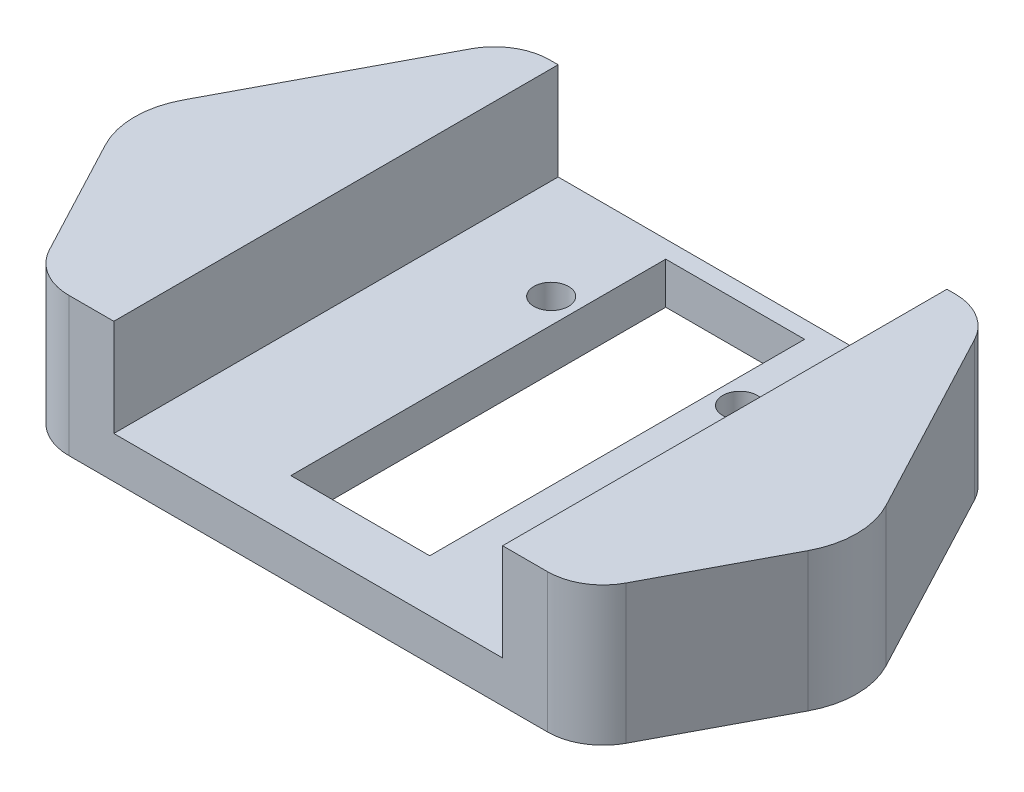
ISO-10303-21;
HEADER;
FILE_DESCRIPTION(('STEP AP214'),'2;1');
FILE_NAME('part.step','',(''),(''),'','','');
FILE_SCHEMA(('AUTOMOTIVE_DESIGN { 1 0 10303 214 1 1 1 1 }'));
ENDSEC;
DATA;
#1=APPLICATION_CONTEXT('core data for automotive mechanical design processes');
#2=APPLICATION_PROTOCOL_DEFINITION('international standard','automotive_design',2000,#1);
#3=PRODUCT_CONTEXT('',#1,'mechanical');
#4=PRODUCT('Part','Part','',(#3));
#5=PRODUCT_RELATED_PRODUCT_CATEGORY('part','',(#4));
#6=PRODUCT_DEFINITION_FORMATION('','',#4);
#7=PRODUCT_DEFINITION_CONTEXT('part definition',#1,'design');
#8=PRODUCT_DEFINITION('design','',#6,#7);
#9=PRODUCT_DEFINITION_SHAPE('','',#8);
#10=(LENGTH_UNIT() NAMED_UNIT(*) SI_UNIT(.MILLI.,.METRE.));
#11=(NAMED_UNIT(*) PLANE_ANGLE_UNIT() SI_UNIT($,.RADIAN.));
#12=(NAMED_UNIT(*) SI_UNIT($,.STERADIAN.) SOLID_ANGLE_UNIT());
#13=UNCERTAINTY_MEASURE_WITH_UNIT(LENGTH_MEASURE(1.E-05),#10,'distance_accuracy_value','');
#14=(GEOMETRIC_REPRESENTATION_CONTEXT(3) GLOBAL_UNCERTAINTY_ASSIGNED_CONTEXT((#13)) GLOBAL_UNIT_ASSIGNED_CONTEXT((#10,
#11,#12)) REPRESENTATION_CONTEXT('',''));
#15=CARTESIAN_POINT('',(0.,0.,0.));
#16=DIRECTION('',(0.,0.,1.));
#17=DIRECTION('',(1.,0.,0.));
#18=AXIS2_PLACEMENT_3D('',#15,#16,#17);
#19=CARTESIAN_POINT('',(-20.,10.,-3.74999999999999));
#20=DIRECTION('',(0.,-1.,0.));
#21=DIRECTION('',(0.,0.,-1.));
#22=AXIS2_PLACEMENT_3D('',#19,#20,#21);
#23=CYLINDRICAL_SURFACE('',#22,2.);
#24=CARTESIAN_POINT('',(-20.,0.,-3.74999999999999));
#25=DIRECTION('',(0.,1.,0.));
#26=DIRECTION('',(0.,0.,1.));
#27=AXIS2_PLACEMENT_3D('',#24,#25,#26);
#28=CIRCLE('',#27,2.);
#29=CARTESIAN_POINT('',(-20.,0.,-1.74999999999999));
#30=VERTEX_POINT('',#29);
#31=EDGE_CURVE('E228',#30,#30,#28,.T.);
#32=ORIENTED_EDGE('',*,*,#31,.F.);
#33=EDGE_LOOP('',(#32));
#34=FACE_BOUND('',#33,.T.);
#35=CARTESIAN_POINT('',(-20.,7.,-3.74999999999999));
#36=DIRECTION('',(0.,1.,0.));
#37=DIRECTION('',(0.,0.,1.));
#38=AXIS2_PLACEMENT_3D('',#35,#36,#37);
#39=CIRCLE('',#38,2.);
#40=CARTESIAN_POINT('',(-20.,7.,-1.74999999999999));
#41=VERTEX_POINT('',#40);
#42=EDGE_CURVE('E222',#41,#41,#39,.T.);
#43=ORIENTED_EDGE('',*,*,#42,.T.);
#44=EDGE_LOOP('',(#43));
#45=FACE_BOUND('',#44,.T.);
#46=ADVANCED_FACE('F40',(#34,#45),#23,.F.);
#47=CARTESIAN_POINT('',(20.,10.,-3.74999999999999));
#48=DIRECTION('',(0.,-1.,0.));
#49=DIRECTION('',(0.,0.,-1.));
#50=AXIS2_PLACEMENT_3D('',#47,#48,#49);
#51=CYLINDRICAL_SURFACE('',#50,2.00000000000001);
#52=CARTESIAN_POINT('',(20.,0.,-3.74999999999999));
#53=DIRECTION('',(0.,1.,0.));
#54=DIRECTION('',(0.,0.,1.));
#55=AXIS2_PLACEMENT_3D('',#52,#53,#54);
#56=CIRCLE('',#55,2.00000000000001);
#57=CARTESIAN_POINT('',(20.,0.,-1.74999999999998));
#58=VERTEX_POINT('',#57);
#59=EDGE_CURVE('E263',#58,#58,#56,.T.);
#60=ORIENTED_EDGE('',*,*,#59,.F.);
#61=EDGE_LOOP('',(#60));
#62=FACE_BOUND('',#61,.T.);
#63=CARTESIAN_POINT('',(20.,7.,-3.74999999999999));
#64=DIRECTION('',(0.,1.,0.));
#65=DIRECTION('',(0.,0.,1.));
#66=AXIS2_PLACEMENT_3D('',#63,#64,#65);
#67=CIRCLE('',#66,2.00000000000001);
#68=CARTESIAN_POINT('',(20.,7.,-1.74999999999998));
#69=VERTEX_POINT('',#68);
#70=EDGE_CURVE('E225',#69,#69,#67,.T.);
#71=ORIENTED_EDGE('',*,*,#70,.T.);
#72=EDGE_LOOP('',(#71));
#73=FACE_BOUND('',#72,.T.);
#74=ADVANCED_FACE('F373',(#62,#73),#51,.F.);
#75=CARTESIAN_POINT('',(0.,3.,0.));
#76=DIRECTION('',(0.,-1.,0.));
#77=DIRECTION('',(0.,0.,-1.));
#78=AXIS2_PLACEMENT_3D('',#75,#76,#77);
#79=PLANE('',#78);
#80=CARTESIAN_POINT('',(-6.8,3.,-14.55));
#81=DIRECTION('',(0.,1.,0.));
#82=DIRECTION('',(0.,0.,1.));
#83=AXIS2_PLACEMENT_3D('',#80,#81,#82);
#84=CIRCLE('',#83,1.25);
#85=CARTESIAN_POINT('',(-6.8,3.,-13.3));
#86=VERTEX_POINT('',#85);
#87=EDGE_CURVE('E202',#86,#86,#84,.T.);
#88=ORIENTED_EDGE('',*,*,#87,.F.);
#89=EDGE_LOOP('',(#88));
#90=FACE_BOUND('',#89,.T.);
#91=CARTESIAN_POINT('',(6.8,3.,-14.55));
#92=DIRECTION('',(0.,1.,0.));
#93=DIRECTION('',(0.,0.,1.));
#94=AXIS2_PLACEMENT_3D('',#91,#92,#93);
#95=CIRCLE('',#94,1.25);
#96=CARTESIAN_POINT('',(6.8,3.,-13.3));
#97=VERTEX_POINT('',#96);
#98=EDGE_CURVE('E199',#97,#97,#95,.T.);
#99=ORIENTED_EDGE('',*,*,#98,.F.);
#100=EDGE_LOOP('',(#99));
#101=FACE_BOUND('',#100,.T.);
#102=DIRECTION('',(1.,0.,0.));
#103=VECTOR('',#102,1.);
#104=CARTESIAN_POINT('',(-5.,3.,6.));
#105=LINE('',#104,#103);
#106=CARTESIAN_POINT('',(-5.,3.,6.));
#107=VERTEX_POINT('',#106);
#108=CARTESIAN_POINT('',(5.,3.,6.));
#109=VERTEX_POINT('',#108);
#110=EDGE_CURVE('E198',#107,#109,#105,.T.);
#111=ORIENTED_EDGE('',*,*,#110,.F.);
#112=DIRECTION('',(0.,0.,1.));
#113=VECTOR('',#112,1.);
#114=CARTESIAN_POINT('',(-5.,3.,-21.));
#115=LINE('',#114,#113);
#116=CARTESIAN_POINT('',(-5.,3.,-21.));
#117=VERTEX_POINT('',#116);
#118=EDGE_CURVE('E57',#117,#107,#115,.T.);
#119=ORIENTED_EDGE('',*,*,#118,.F.);
#120=DIRECTION('',(-1.,0.,0.));
#121=VECTOR('',#120,1.);
#122=CARTESIAN_POINT('',(-5.,3.,-21.));
#123=LINE('',#122,#121);
#124=CARTESIAN_POINT('',(5.,3.,-21.));
#125=VERTEX_POINT('',#124);
#126=EDGE_CURVE('E186',#125,#117,#123,.T.);
#127=ORIENTED_EDGE('',*,*,#126,.F.);
#128=DIRECTION('',(0.,0.,-1.));
#129=VECTOR('',#128,1.);
#130=CARTESIAN_POINT('',(5.,3.,-21.));
#131=LINE('',#130,#129);
#132=EDGE_CURVE('E192',#109,#125,#131,.T.);
#133=ORIENTED_EDGE('',*,*,#132,.F.);
#134=EDGE_LOOP('',(#111,#119,#127,#133));
#135=FACE_BOUND('',#134,.T.);
#136=DIRECTION('',(0.,0.,-1.));
#137=VECTOR('',#136,1.);
#138=CARTESIAN_POINT('',(-14.,3.,0.));
#139=LINE('',#138,#137);
#140=CARTESIAN_POINT('',(-14.,3.,9.75));
#141=VERTEX_POINT('',#140);
#142=CARTESIAN_POINT('',(-14.,3.,-22.25));
#143=VERTEX_POINT('',#142);
#144=EDGE_CURVE('E261',#141,#143,#139,.T.);
#145=ORIENTED_EDGE('',*,*,#144,.F.);
#146=DIRECTION('',(1.,0.,0.));
#147=VECTOR('',#146,1.);
#148=CARTESIAN_POINT('',(0.,3.,9.75));
#149=LINE('',#148,#147);
#150=CARTESIAN_POINT('',(14.,3.,9.75000000000001));
#151=VERTEX_POINT('',#150);
#152=EDGE_CURVE('E216',#141,#151,#149,.T.);
#153=ORIENTED_EDGE('',*,*,#152,.T.);
#154=DIRECTION('',(0.,0.,1.));
#155=VECTOR('',#154,1.);
#156=CARTESIAN_POINT('',(14.,3.,0.));
#157=LINE('',#156,#155);
#158=CARTESIAN_POINT('',(14.,3.,-22.25));
#159=VERTEX_POINT('',#158);
#160=EDGE_CURVE('E293',#159,#151,#157,.T.);
#161=ORIENTED_EDGE('',*,*,#160,.F.);
#162=DIRECTION('',(-1.,0.,0.));
#163=VECTOR('',#162,1.);
#164=CARTESIAN_POINT('',(-14.,3.,-22.25));
#165=LINE('',#164,#163);
#166=EDGE_CURVE('E297',#159,#143,#165,.T.);
#167=ORIENTED_EDGE('',*,*,#166,.T.);
#168=EDGE_LOOP('',(#145,#153,#161,#167));
#169=FACE_BOUND('',#168,.T.);
#170=ADVANCED_FACE('F196',(#90,#101,#135,#169),#79,.F.);
#171=CARTESIAN_POINT('',(-14.,3.,-22.25));
#172=DIRECTION('',(0.,0.,1.));
#173=DIRECTION('',(1.,0.,0.));
#174=AXIS2_PLACEMENT_3D('',#171,#172,#173);
#175=PLANE('',#174);
#176=DIRECTION('',(-1.,0.,0.));
#177=VECTOR('',#176,1.);
#178=CARTESIAN_POINT('',(14.,10.,-22.25));
#179=LINE('',#178,#177);
#180=CARTESIAN_POINT('',(14.5909745461935,10.,-22.25));
#181=VERTEX_POINT('',#180);
#182=CARTESIAN_POINT('',(14.,10.,-22.25));
#183=VERTEX_POINT('',#182);
#184=EDGE_CURVE('E267',#181,#183,#179,.T.);
#185=ORIENTED_EDGE('',*,*,#184,.F.);
#186=DIRECTION('',(0.,-1.,0.));
#187=VECTOR('',#186,1.);
#188=CARTESIAN_POINT('',(14.5909745461935,3.,-22.25));
#189=LINE('',#188,#187);
#190=CARTESIAN_POINT('',(14.5909745461935,0.,-22.25));
#191=VERTEX_POINT('',#190);
#192=EDGE_CURVE('E304',#181,#191,#189,.T.);
#193=ORIENTED_EDGE('',*,*,#192,.T.);
#194=DIRECTION('',(-1.,0.,0.));
#195=VECTOR('',#194,1.);
#196=CARTESIAN_POINT('',(-14.,0.,-22.25));
#197=LINE('',#196,#195);
#198=CARTESIAN_POINT('',(-14.5909745461935,0.,-22.25));
#199=VERTEX_POINT('',#198);
#200=EDGE_CURVE('E296',#191,#199,#197,.T.);
#201=ORIENTED_EDGE('',*,*,#200,.T.);
#202=DIRECTION('',(0.,-1.,0.));
#203=VECTOR('',#202,1.);
#204=CARTESIAN_POINT('',(-14.5909745461935,3.,-22.25));
#205=LINE('',#204,#203);
#206=CARTESIAN_POINT('',(-14.5909745461935,10.,-22.25));
#207=VERTEX_POINT('',#206);
#208=EDGE_CURVE('E300',#199,#207,#205,.F.);
#209=ORIENTED_EDGE('',*,*,#208,.T.);
#210=DIRECTION('',(-1.,0.,0.));
#211=VECTOR('',#210,1.);
#212=CARTESIAN_POINT('',(-14.,10.,-22.25));
#213=LINE('',#212,#211);
#214=CARTESIAN_POINT('',(-14.,10.,-22.25));
#215=VERTEX_POINT('',#214);
#216=EDGE_CURVE('E241',#215,#207,#213,.T.);
#217=ORIENTED_EDGE('',*,*,#216,.F.);
#218=DIRECTION('',(0.,-1.,0.));
#219=VECTOR('',#218,1.);
#220=CARTESIAN_POINT('',(-14.,10.,-22.25));
#221=LINE('',#220,#219);
#222=EDGE_CURVE('E255',#215,#143,#221,.T.);
#223=ORIENTED_EDGE('',*,*,#222,.T.);
#224=ORIENTED_EDGE('',*,*,#166,.F.);
#225=DIRECTION('',(0.,-1.,0.));
#226=VECTOR('',#225,1.);
#227=CARTESIAN_POINT('',(14.,10.,-22.25));
#228=LINE('',#227,#226);
#229=EDGE_CURVE('E291',#183,#159,#228,.T.);
#230=ORIENTED_EDGE('',*,*,#229,.F.);
#231=EDGE_LOOP('',(#185,#193,#201,#209,#217,#223,#224,#230));
#232=FACE_BOUND('',#231,.T.);
#233=ADVANCED_FACE('F364',(#232),#175,.F.);
#234=CARTESIAN_POINT('',(0.,0.,0.));
#235=DIRECTION('',(0.,-1.,0.));
#236=DIRECTION('',(0.,0.,-1.));
#237=AXIS2_PLACEMENT_3D('',#234,#235,#236);
#238=PLANE('',#237);
#239=CARTESIAN_POINT('',(-6.8,0.,-14.55));
#240=DIRECTION('',(0.,-1.,0.));
#241=DIRECTION('',(0.,0.,-1.));
#242=AXIS2_PLACEMENT_3D('',#239,#240,#241);
#243=CIRCLE('',#242,1.25);
#244=CARTESIAN_POINT('',(-6.8,0.,-15.8));
#245=VERTEX_POINT('',#244);
#246=EDGE_CURVE('E44',#245,#245,#243,.T.);
#247=ORIENTED_EDGE('',*,*,#246,.F.);
#248=EDGE_LOOP('',(#247));
#249=FACE_BOUND('',#248,.T.);
#250=CARTESIAN_POINT('',(6.8,0.,-14.55));
#251=DIRECTION('',(0.,-1.,0.));
#252=DIRECTION('',(0.,0.,-1.));
#253=AXIS2_PLACEMENT_3D('',#250,#251,#252);
#254=CIRCLE('',#253,1.25);
#255=CARTESIAN_POINT('',(6.8,0.,-15.8));
#256=VERTEX_POINT('',#255);
#257=EDGE_CURVE('E342',#256,#256,#254,.T.);
#258=ORIENTED_EDGE('',*,*,#257,.F.);
#259=EDGE_LOOP('',(#258));
#260=FACE_BOUND('',#259,.T.);
#261=DIRECTION('',(0.,0.,-1.));
#262=VECTOR('',#261,1.);
#263=CARTESIAN_POINT('',(-5.,0.,0.));
#264=LINE('',#263,#262);
#265=CARTESIAN_POINT('',(-5.,0.,6.));
#266=VERTEX_POINT('',#265);
#267=CARTESIAN_POINT('',(-5.,0.,-21.));
#268=VERTEX_POINT('',#267);
#269=EDGE_CURVE('E11',#266,#268,#264,.T.);
#270=ORIENTED_EDGE('',*,*,#269,.F.);
#271=DIRECTION('',(-1.,0.,0.));
#272=VECTOR('',#271,1.);
#273=CARTESIAN_POINT('',(0.,0.,6.));
#274=LINE('',#273,#272);
#275=CARTESIAN_POINT('',(5.,0.,6.));
#276=VERTEX_POINT('',#275);
#277=EDGE_CURVE('E338',#276,#266,#274,.T.);
#278=ORIENTED_EDGE('',*,*,#277,.F.);
#279=DIRECTION('',(0.,0.,1.));
#280=VECTOR('',#279,1.);
#281=CARTESIAN_POINT('',(5.,0.,0.));
#282=LINE('',#281,#280);
#283=CARTESIAN_POINT('',(5.,0.,-21.));
#284=VERTEX_POINT('',#283);
#285=EDGE_CURVE('E340',#284,#276,#282,.T.);
#286=ORIENTED_EDGE('',*,*,#285,.F.);
#287=DIRECTION('',(1.,0.,0.));
#288=VECTOR('',#287,1.);
#289=CARTESIAN_POINT('',(0.,0.,-21.));
#290=LINE('',#289,#288);
#291=EDGE_CURVE('E49',#268,#284,#290,.T.);
#292=ORIENTED_EDGE('',*,*,#291,.F.);
#293=EDGE_LOOP('',(#270,#278,#286,#292));
#294=FACE_BOUND('',#293,.T.);
#295=ORIENTED_EDGE('',*,*,#200,.F.);
#296=CARTESIAN_POINT('',(14.5909745461935,0.,-18.25));
#297=DIRECTION('',(0.,-1.,0.));
#298=DIRECTION('',(0.,0.,-1.));
#299=AXIS2_PLACEMENT_3D('',#296,#297,#298);
#300=CIRCLE('',#299,4.);
#301=CARTESIAN_POINT('',(18.1266066798242,0.,-20.1206430486969));
#302=VERTEX_POINT('',#301);
#303=EDGE_CURVE('E313',#191,#302,#300,.T.);
#304=ORIENTED_EDGE('',*,*,#303,.T.);
#305=DIRECTION('',(-0.467660762174217,0.,-0.883908033407679));
#306=VECTOR('',#305,1.);
#307=CARTESIAN_POINT('',(17.,0.,-22.25));
#308=LINE('',#307,#306);
#309=CARTESIAN_POINT('',(25.303448200446,0.,-6.55596457304529));
#310=VERTEX_POINT('',#309);
#311=EDGE_CURVE('E270',#310,#302,#308,.T.);
#312=ORIENTED_EDGE('',*,*,#311,.F.);
#313=CARTESIAN_POINT('',(20.,0.,-3.74999999999999));
#314=DIRECTION('',(0.,1.,0.));
#315=DIRECTION('',(0.,0.,1.));
#316=AXIS2_PLACEMENT_3D('',#313,#314,#315);
#317=CIRCLE('',#316,6.);
#318=CARTESIAN_POINT('',(25.303448200446,0.,-0.944035426954687));
#319=VERTEX_POINT('',#318);
#320=EDGE_CURVE('E282',#319,#310,#317,.T.);
#321=ORIENTED_EDGE('',*,*,#320,.F.);
#322=DIRECTION('',(0.467660762174217,0.,-0.883908033407679));
#323=VECTOR('',#322,1.);
#324=CARTESIAN_POINT('',(25.303448200446,0.,-0.944035426954686));
#325=LINE('',#324,#323);
#326=CARTESIAN_POINT('',(20.7720219521081,0.,7.62064304869687));
#327=VERTEX_POINT('',#326);
#328=EDGE_CURVE('E266',#327,#319,#325,.T.);
#329=ORIENTED_EDGE('',*,*,#328,.F.);
#330=CARTESIAN_POINT('',(17.2363898184774,0.,5.75));
#331=DIRECTION('',(0.,-1.,0.));
#332=DIRECTION('',(0.,0.,-1.));
#333=AXIS2_PLACEMENT_3D('',#330,#331,#332);
#334=CIRCLE('',#333,4.);
#335=CARTESIAN_POINT('',(17.2363898184774,0.,9.75000000000001));
#336=VERTEX_POINT('',#335);
#337=EDGE_CURVE('E309',#327,#336,#334,.T.);
#338=ORIENTED_EDGE('',*,*,#337,.T.);
#339=DIRECTION('',(1.,0.,0.));
#340=VECTOR('',#339,1.);
#341=CARTESIAN_POINT('',(19.6454152722839,0.,9.75000000000001));
#342=LINE('',#341,#340);
#343=CARTESIAN_POINT('',(-17.2363898184774,0.,9.75));
#344=VERTEX_POINT('',#343);
#345=EDGE_CURVE('E211',#344,#336,#342,.T.);
#346=ORIENTED_EDGE('',*,*,#345,.F.);
#347=CARTESIAN_POINT('',(-17.2363898184774,0.,5.75));
#348=DIRECTION('',(0.,-1.,0.));
#349=DIRECTION('',(0.,0.,-1.));
#350=AXIS2_PLACEMENT_3D('',#347,#348,#349);
#351=CIRCLE('',#350,4.);
#352=CARTESIAN_POINT('',(-20.7720219521081,0.,7.62064304869687));
#353=VERTEX_POINT('',#352);
#354=EDGE_CURVE('E307',#344,#353,#351,.T.);
#355=ORIENTED_EDGE('',*,*,#354,.T.);
#356=DIRECTION('',(0.467660762174218,0.,0.883908033407678));
#357=VECTOR('',#356,1.);
#358=CARTESIAN_POINT('',(-25.3034482004461,0.,-0.944035426954684));
#359=LINE('',#358,#357);
#360=CARTESIAN_POINT('',(-25.3034482004461,0.,-0.944035426954684));
#361=VERTEX_POINT('',#360);
#362=EDGE_CURVE('E249',#361,#353,#359,.T.);
#363=ORIENTED_EDGE('',*,*,#362,.F.);
#364=CARTESIAN_POINT('',(-20.,0.,-3.74999999999999));
#365=DIRECTION('',(0.,1.,0.));
#366=DIRECTION('',(0.,0.,1.));
#367=AXIS2_PLACEMENT_3D('',#364,#365,#366);
#368=CIRCLE('',#367,6.);
#369=CARTESIAN_POINT('',(-25.3034482004461,0.,-6.5559645730453));
#370=VERTEX_POINT('',#369);
#371=EDGE_CURVE('E231',#370,#361,#368,.T.);
#372=ORIENTED_EDGE('',*,*,#371,.F.);
#373=DIRECTION('',(-0.467660762174218,0.,0.883908033407678));
#374=VECTOR('',#373,1.);
#375=CARTESIAN_POINT('',(-25.3034482004461,0.,-6.5559645730453));
#376=LINE('',#375,#374);
#377=CARTESIAN_POINT('',(-18.1266066798242,0.,-20.1206430486969));
#378=VERTEX_POINT('',#377);
#379=EDGE_CURVE('E236',#378,#370,#376,.T.);
#380=ORIENTED_EDGE('',*,*,#379,.F.);
#381=CARTESIAN_POINT('',(-14.5909745461935,0.,-18.25));
#382=DIRECTION('',(0.,-1.,0.));
#383=DIRECTION('',(0.,0.,-1.));
#384=AXIS2_PLACEMENT_3D('',#381,#382,#383);
#385=CIRCLE('',#384,4.);
#386=EDGE_CURVE('E311',#378,#199,#385,.T.);
#387=ORIENTED_EDGE('',*,*,#386,.T.);
#388=EDGE_LOOP('',(#295,#304,#312,#321,#329,#338,#346,#355,#363,#372,#380,#387));
#389=FACE_BOUND('',#388,.T.);
#390=ORIENTED_EDGE('',*,*,#31,.T.);
#391=EDGE_LOOP('',(#390));
#392=FACE_BOUND('',#391,.T.);
#393=ORIENTED_EDGE('',*,*,#59,.T.);
#394=EDGE_LOOP('',(#393));
#395=FACE_BOUND('',#394,.T.);
#396=ADVANCED_FACE('F360',(#249,#260,#294,#389,#392,#395),#238,.T.);
#397=CARTESIAN_POINT('',(14.,10.,14.75));
#398=DIRECTION('',(1.,0.,0.));
#399=DIRECTION('',(0.,0.,-1.));
#400=AXIS2_PLACEMENT_3D('',#397,#398,#399);
#401=PLANE('',#400);
#402=ORIENTED_EDGE('',*,*,#160,.T.);
#403=DIRECTION('',(0.,1.,0.));
#404=VECTOR('',#403,1.);
#405=CARTESIAN_POINT('',(14.,10.,9.75000000000001));
#406=LINE('',#405,#404);
#407=CARTESIAN_POINT('',(14.,10.,9.75000000000001));
#408=VERTEX_POINT('',#407);
#409=EDGE_CURVE('E219',#151,#408,#406,.T.);
#410=ORIENTED_EDGE('',*,*,#409,.T.);
#411=DIRECTION('',(0.,0.,1.));
#412=VECTOR('',#411,1.);
#413=CARTESIAN_POINT('',(14.,10.,14.75));
#414=LINE('',#413,#412);
#415=EDGE_CURVE('E269',#183,#408,#414,.T.);
#416=ORIENTED_EDGE('',*,*,#415,.F.);
#417=ORIENTED_EDGE('',*,*,#229,.T.);
#418=EDGE_LOOP('',(#402,#410,#416,#417));
#419=FACE_BOUND('',#418,.T.);
#420=ADVANCED_FACE('F363',(#419),#401,.F.);
#421=CARTESIAN_POINT('',(20.,10.,-3.74999999999999));
#422=DIRECTION('',(0.,1.,0.));
#423=DIRECTION('',(0.,0.,1.));
#424=AXIS2_PLACEMENT_3D('',#421,#422,#423);
#425=PLANE('',#424);
#426=DIRECTION('',(-0.467660762174217,0.,-0.883908033407679));
#427=VECTOR('',#426,1.);
#428=CARTESIAN_POINT('',(17.,10.,-22.25));
#429=LINE('',#428,#427);
#430=CARTESIAN_POINT('',(25.303448200446,10.,-6.55596457304529));
#431=VERTEX_POINT('',#430);
#432=CARTESIAN_POINT('',(18.1266066798242,10.,-20.1206430486969));
#433=VERTEX_POINT('',#432);
#434=EDGE_CURVE('E277',#431,#433,#429,.T.);
#435=ORIENTED_EDGE('',*,*,#434,.T.);
#436=CARTESIAN_POINT('',(14.5909745461935,10.,-18.25));
#437=DIRECTION('',(0.,1.,0.));
#438=DIRECTION('',(0.,0.,1.));
#439=AXIS2_PLACEMENT_3D('',#436,#437,#438);
#440=CIRCLE('',#439,4.);
#441=EDGE_CURVE('E319',#433,#181,#440,.T.);
#442=ORIENTED_EDGE('',*,*,#441,.T.);
#443=ORIENTED_EDGE('',*,*,#184,.T.);
#444=ORIENTED_EDGE('',*,*,#415,.T.);
#445=DIRECTION('',(1.,0.,0.));
#446=VECTOR('',#445,1.);
#447=CARTESIAN_POINT('',(19.6454152722839,10.,9.75000000000001));
#448=LINE('',#447,#446);
#449=CARTESIAN_POINT('',(17.2363898184774,10.,9.75000000000001));
#450=VERTEX_POINT('',#449);
#451=EDGE_CURVE('E210',#408,#450,#448,.T.);
#452=ORIENTED_EDGE('',*,*,#451,.T.);
#453=CARTESIAN_POINT('',(17.2363898184774,10.,5.75));
#454=DIRECTION('',(0.,1.,0.));
#455=DIRECTION('',(0.,0.,1.));
#456=AXIS2_PLACEMENT_3D('',#453,#454,#455);
#457=CIRCLE('',#456,4.);
#458=CARTESIAN_POINT('',(20.7720219521081,10.,7.62064304869687));
#459=VERTEX_POINT('',#458);
#460=EDGE_CURVE('E317',#450,#459,#457,.T.);
#461=ORIENTED_EDGE('',*,*,#460,.T.);
#462=DIRECTION('',(0.467660762174217,0.,-0.883908033407679));
#463=VECTOR('',#462,1.);
#464=CARTESIAN_POINT('',(25.303448200446,10.,-0.944035426954686));
#465=LINE('',#464,#463);
#466=CARTESIAN_POINT('',(25.303448200446,10.,-0.944035426954687));
#467=VERTEX_POINT('',#466);
#468=EDGE_CURVE('E273',#459,#467,#465,.T.);
#469=ORIENTED_EDGE('',*,*,#468,.T.);
#470=CARTESIAN_POINT('',(20.,10.,-3.74999999999999));
#471=DIRECTION('',(0.,1.,0.));
#472=DIRECTION('',(0.,0.,1.));
#473=AXIS2_PLACEMENT_3D('',#470,#471,#472);
#474=CIRCLE('',#473,6.);
#475=EDGE_CURVE('E275',#467,#431,#474,.T.);
#476=ORIENTED_EDGE('',*,*,#475,.T.);
#477=EDGE_LOOP('',(#435,#442,#443,#444,#452,#461,#469,#476));
#478=FACE_BOUND('',#477,.T.);
#479=ADVANCED_FACE('F417',(#478),#425,.T.);
#480=CARTESIAN_POINT('',(25.303448200446,10.,-0.944035426954686));
#481=DIRECTION('',(-0.883908033407679,0.,-0.467660762174217));
#482=DIRECTION('',(-0.467660762174217,0.,0.883908033407679));
#483=AXIS2_PLACEMENT_3D('',#480,#481,#482);
#484=PLANE('',#483);
#485=ORIENTED_EDGE('',*,*,#468,.F.);
#486=DIRECTION('',(0.,-1.,0.));
#487=VECTOR('',#486,1.);
#488=CARTESIAN_POINT('',(20.7720219521081,10.,7.62064304869687));
#489=LINE('',#488,#487);
#490=EDGE_CURVE('E328',#459,#327,#489,.T.);
#491=ORIENTED_EDGE('',*,*,#490,.T.);
#492=ORIENTED_EDGE('',*,*,#328,.T.);
#493=DIRECTION('',(0.,-1.,0.));
#494=VECTOR('',#493,1.);
#495=CARTESIAN_POINT('',(25.303448200446,10.,-0.944035426954687));
#496=LINE('',#495,#494);
#497=EDGE_CURVE('E288',#467,#319,#496,.T.);
#498=ORIENTED_EDGE('',*,*,#497,.F.);
#499=EDGE_LOOP('',(#485,#491,#492,#498));
#500=FACE_BOUND('',#499,.T.);
#501=ADVANCED_FACE('F420',(#500),#484,.F.);
#502=CARTESIAN_POINT('',(20.,10.,-3.74999999999999));
#503=DIRECTION('',(0.,-1.,0.));
#504=DIRECTION('',(0.,0.,-1.));
#505=AXIS2_PLACEMENT_3D('',#502,#503,#504);
#506=CYLINDRICAL_SURFACE('',#505,6.);
#507=ORIENTED_EDGE('',*,*,#320,.T.);
#508=DIRECTION('',(0.,-1.,0.));
#509=VECTOR('',#508,1.);
#510=CARTESIAN_POINT('',(25.303448200446,10.,-6.55596457304529));
#511=LINE('',#510,#509);
#512=EDGE_CURVE('E280',#431,#310,#511,.T.);
#513=ORIENTED_EDGE('',*,*,#512,.F.);
#514=ORIENTED_EDGE('',*,*,#475,.F.);
#515=ORIENTED_EDGE('',*,*,#497,.T.);
#516=EDGE_LOOP('',(#507,#513,#514,#515));
#517=FACE_BOUND('',#516,.T.);
#518=ADVANCED_FACE('F424',(#517),#506,.T.);
#519=CARTESIAN_POINT('',(17.,10.,-22.25));
#520=DIRECTION('',(-0.883908033407679,0.,0.467660762174217));
#521=DIRECTION('',(0.467660762174217,0.,0.883908033407679));
#522=AXIS2_PLACEMENT_3D('',#519,#520,#521);
#523=PLANE('',#522);
#524=ORIENTED_EDGE('',*,*,#311,.T.);
#525=DIRECTION('',(0.,-1.,0.));
#526=VECTOR('',#525,1.);
#527=CARTESIAN_POINT('',(18.1266066798242,10.,-20.1206430486969));
#528=LINE('',#527,#526);
#529=EDGE_CURVE('E315',#302,#433,#528,.F.);
#530=ORIENTED_EDGE('',*,*,#529,.T.);
#531=ORIENTED_EDGE('',*,*,#434,.F.);
#532=ORIENTED_EDGE('',*,*,#512,.T.);
#533=EDGE_LOOP('',(#524,#530,#531,#532));
#534=FACE_BOUND('',#533,.T.);
#535=ADVANCED_FACE('F409',(#534),#523,.F.);
#536=CARTESIAN_POINT('',(-14.,10.,14.75));
#537=DIRECTION('',(-1.,0.,0.));
#538=DIRECTION('',(0.,0.,1.));
#539=AXIS2_PLACEMENT_3D('',#536,#537,#538);
#540=PLANE('',#539);
#541=DIRECTION('',(0.,0.,-1.));
#542=VECTOR('',#541,1.);
#543=CARTESIAN_POINT('',(-14.,10.,14.75));
#544=LINE('',#543,#542);
#545=CARTESIAN_POINT('',(-14.,10.,9.75));
#546=VERTEX_POINT('',#545);
#547=EDGE_CURVE('E239',#546,#215,#544,.T.);
#548=ORIENTED_EDGE('',*,*,#547,.F.);
#549=DIRECTION('',(0.,-1.,0.));
#550=VECTOR('',#549,1.);
#551=CARTESIAN_POINT('',(-14.,10.,9.75));
#552=LINE('',#551,#550);
#553=EDGE_CURVE('E209',#546,#141,#552,.T.);
#554=ORIENTED_EDGE('',*,*,#553,.T.);
#555=ORIENTED_EDGE('',*,*,#144,.T.);
#556=ORIENTED_EDGE('',*,*,#222,.F.);
#557=EDGE_LOOP('',(#548,#554,#555,#556));
#558=FACE_BOUND('',#557,.T.);
#559=ADVANCED_FACE('F404',(#558),#540,.F.);
#560=CARTESIAN_POINT('',(-20.,10.,-3.74999999999999));
#561=DIRECTION('',(0.,1.,0.));
#562=DIRECTION('',(0.,0.,1.));
#563=AXIS2_PLACEMENT_3D('',#560,#561,#562);
#564=PLANE('',#563);
#565=ORIENTED_EDGE('',*,*,#216,.T.);
#566=CARTESIAN_POINT('',(-14.5909745461935,10.,-18.25));
#567=DIRECTION('',(0.,1.,0.));
#568=DIRECTION('',(0.,0.,1.));
#569=AXIS2_PLACEMENT_3D('',#566,#567,#568);
#570=CIRCLE('',#569,4.);
#571=CARTESIAN_POINT('',(-18.1266066798242,10.,-20.1206430486969));
#572=VERTEX_POINT('',#571);
#573=EDGE_CURVE('E326',#207,#572,#570,.T.);
#574=ORIENTED_EDGE('',*,*,#573,.T.);
#575=DIRECTION('',(-0.467660762174218,0.,0.883908033407678));
#576=VECTOR('',#575,1.);
#577=CARTESIAN_POINT('',(-25.3034482004461,10.,-6.5559645730453));
#578=LINE('',#577,#576);
#579=CARTESIAN_POINT('',(-25.3034482004461,10.,-6.5559645730453));
#580=VERTEX_POINT('',#579);
#581=EDGE_CURVE('E244',#572,#580,#578,.T.);
#582=ORIENTED_EDGE('',*,*,#581,.T.);
#583=CARTESIAN_POINT('',(-20.,10.,-3.74999999999999));
#584=DIRECTION('',(0.,1.,0.));
#585=DIRECTION('',(0.,0.,1.));
#586=AXIS2_PLACEMENT_3D('',#583,#584,#585);
#587=CIRCLE('',#586,6.);
#588=CARTESIAN_POINT('',(-25.3034482004461,10.,-0.944035426954684));
#589=VERTEX_POINT('',#588);
#590=EDGE_CURVE('E232',#580,#589,#587,.T.);
#591=ORIENTED_EDGE('',*,*,#590,.T.);
#592=DIRECTION('',(0.467660762174218,0.,0.883908033407678));
#593=VECTOR('',#592,1.);
#594=CARTESIAN_POINT('',(-25.3034482004461,10.,-0.944035426954684));
#595=LINE('',#594,#593);
#596=CARTESIAN_POINT('',(-20.7720219521081,10.,7.62064304869687));
#597=VERTEX_POINT('',#596);
#598=EDGE_CURVE('E235',#589,#597,#595,.T.);
#599=ORIENTED_EDGE('',*,*,#598,.T.);
#600=CARTESIAN_POINT('',(-17.2363898184774,10.,5.75));
#601=DIRECTION('',(0.,1.,0.));
#602=DIRECTION('',(0.,0.,1.));
#603=AXIS2_PLACEMENT_3D('',#600,#601,#602);
#604=CIRCLE('',#603,4.);
#605=CARTESIAN_POINT('',(-17.2363898184774,10.,9.75));
#606=VERTEX_POINT('',#605);
#607=EDGE_CURVE('E324',#597,#606,#604,.T.);
#608=ORIENTED_EDGE('',*,*,#607,.T.);
#609=EDGE_CURVE('E207',#606,#546,#448,.T.);
#610=ORIENTED_EDGE('',*,*,#609,.T.);
#611=ORIENTED_EDGE('',*,*,#547,.T.);
#612=EDGE_LOOP('',(#565,#574,#582,#591,#599,#608,#610,#611));
#613=FACE_BOUND('',#612,.T.);
#614=ADVANCED_FACE('F401',(#613),#564,.T.);
#615=CARTESIAN_POINT('',(-20.,10.,-3.74999999999999));
#616=DIRECTION('',(0.,-1.,0.));
#617=DIRECTION('',(0.,0.,-1.));
#618=AXIS2_PLACEMENT_3D('',#615,#616,#617);
#619=CYLINDRICAL_SURFACE('',#618,6.);
#620=ORIENTED_EDGE('',*,*,#371,.T.);
#621=DIRECTION('',(0.,-1.,0.));
#622=VECTOR('',#621,1.);
#623=CARTESIAN_POINT('',(-25.3034482004461,10.,-0.944035426954684));
#624=LINE('',#623,#622);
#625=EDGE_CURVE('E258',#589,#361,#624,.T.);
#626=ORIENTED_EDGE('',*,*,#625,.F.);
#627=ORIENTED_EDGE('',*,*,#590,.F.);
#628=DIRECTION('',(0.,-1.,0.));
#629=VECTOR('',#628,1.);
#630=CARTESIAN_POINT('',(-25.3034482004461,10.,-6.5559645730453));
#631=LINE('',#630,#629);
#632=EDGE_CURVE('E246',#580,#370,#631,.T.);
#633=ORIENTED_EDGE('',*,*,#632,.T.);
#634=EDGE_LOOP('',(#620,#626,#627,#633));
#635=FACE_BOUND('',#634,.T.);
#636=ADVANCED_FACE('F403',(#635),#619,.T.);
#637=CARTESIAN_POINT('',(-25.3034482004461,10.,-0.944035426954684));
#638=DIRECTION('',(0.883908033407678,0.,-0.467660762174218));
#639=DIRECTION('',(-0.467660762174218,0.,-0.883908033407678));
#640=AXIS2_PLACEMENT_3D('',#637,#638,#639);
#641=PLANE('',#640);
#642=ORIENTED_EDGE('',*,*,#362,.T.);
#643=DIRECTION('',(0.,-1.,0.));
#644=VECTOR('',#643,1.);
#645=CARTESIAN_POINT('',(-20.7720219521081,10.,7.62064304869688));
#646=LINE('',#645,#644);
#647=EDGE_CURVE('E336',#353,#597,#646,.F.);
#648=ORIENTED_EDGE('',*,*,#647,.T.);
#649=ORIENTED_EDGE('',*,*,#598,.F.);
#650=ORIENTED_EDGE('',*,*,#625,.T.);
#651=EDGE_LOOP('',(#642,#648,#649,#650));
#652=FACE_BOUND('',#651,.T.);
#653=ADVANCED_FACE('F391',(#652),#641,.F.);
#654=CARTESIAN_POINT('',(-25.3034482004461,10.,-6.5559645730453));
#655=DIRECTION('',(0.883908033407678,0.,0.467660762174218));
#656=DIRECTION('',(0.467660762174219,0.,-0.883908033407678));
#657=AXIS2_PLACEMENT_3D('',#654,#655,#656);
#658=PLANE('',#657);
#659=ORIENTED_EDGE('',*,*,#581,.F.);
#660=DIRECTION('',(0.,-1.,0.));
#661=VECTOR('',#660,1.);
#662=CARTESIAN_POINT('',(-18.1266066798242,10.,-20.1206430486969));
#663=LINE('',#662,#661);
#664=EDGE_CURVE('E321',#572,#378,#663,.T.);
#665=ORIENTED_EDGE('',*,*,#664,.T.);
#666=ORIENTED_EDGE('',*,*,#379,.T.);
#667=ORIENTED_EDGE('',*,*,#632,.F.);
#668=EDGE_LOOP('',(#659,#665,#666,#667));
#669=FACE_BOUND('',#668,.T.);
#670=ADVANCED_FACE('F382',(#669),#658,.F.);
#671=CARTESIAN_POINT('',(20.,7.,-3.74999999999999));
#672=DIRECTION('',(0.,1.,0.));
#673=DIRECTION('',(0.,0.,1.));
#674=AXIS2_PLACEMENT_3D('',#671,#672,#673);
#675=PLANE('',#674);
#676=ORIENTED_EDGE('',*,*,#70,.F.);
#677=EDGE_LOOP('',(#676));
#678=FACE_BOUND('',#677,.T.);
#679=ADVANCED_FACE('F379',(#678),#675,.F.);
#680=CARTESIAN_POINT('',(-20.,7.,-3.74999999999999));
#681=DIRECTION('',(0.,1.,0.));
#682=DIRECTION('',(0.,0.,1.));
#683=AXIS2_PLACEMENT_3D('',#680,#681,#682);
#684=PLANE('',#683);
#685=ORIENTED_EDGE('',*,*,#42,.F.);
#686=EDGE_LOOP('',(#685));
#687=FACE_BOUND('',#686,.T.);
#688=ADVANCED_FACE('F381',(#687),#684,.F.);
#689=CARTESIAN_POINT('',(19.6454152722839,10.,9.75000000000001));
#690=DIRECTION('',(0.,0.,-1.));
#691=DIRECTION('',(-1.,0.,0.));
#692=AXIS2_PLACEMENT_3D('',#689,#690,#691);
#693=PLANE('',#692);
#694=ORIENTED_EDGE('',*,*,#345,.T.);
#695=DIRECTION('',(0.,-1.,0.));
#696=VECTOR('',#695,1.);
#697=CARTESIAN_POINT('',(17.2363898184774,10.,9.75000000000001));
#698=LINE('',#697,#696);
#699=EDGE_CURVE('E334',#336,#450,#698,.F.);
#700=ORIENTED_EDGE('',*,*,#699,.T.);
#701=ORIENTED_EDGE('',*,*,#451,.F.);
#702=ORIENTED_EDGE('',*,*,#409,.F.);
#703=ORIENTED_EDGE('',*,*,#152,.F.);
#704=ORIENTED_EDGE('',*,*,#553,.F.);
#705=ORIENTED_EDGE('',*,*,#609,.F.);
#706=DIRECTION('',(0.,-1.,0.));
#707=VECTOR('',#706,1.);
#708=CARTESIAN_POINT('',(-17.2363898184774,10.,9.75));
#709=LINE('',#708,#707);
#710=EDGE_CURVE('E331',#606,#344,#709,.T.);
#711=ORIENTED_EDGE('',*,*,#710,.T.);
#712=EDGE_LOOP('',(#694,#700,#701,#702,#703,#704,#705,#711));
#713=FACE_BOUND('',#712,.T.);
#714=ADVANCED_FACE('F388',(#713),#693,.F.);
#715=CARTESIAN_POINT('',(14.5909745461935,3.,-18.25));
#716=DIRECTION('',(0.,-1.,0.));
#717=DIRECTION('',(0.,0.,-1.));
#718=AXIS2_PLACEMENT_3D('',#715,#716,#717);
#719=CYLINDRICAL_SURFACE('',#718,4.);
#720=ORIENTED_EDGE('',*,*,#441,.F.);
#721=ORIENTED_EDGE('',*,*,#529,.F.);
#722=ORIENTED_EDGE('',*,*,#303,.F.);
#723=ORIENTED_EDGE('',*,*,#192,.F.);
#724=EDGE_LOOP('',(#720,#721,#722,#723));
#725=FACE_BOUND('',#724,.T.);
#726=ADVANCED_FACE('F441',(#725),#719,.T.);
#727=CARTESIAN_POINT('',(-14.5909745461935,10.,-18.25));
#728=DIRECTION('',(0.,-1.,0.));
#729=DIRECTION('',(0.,0.,-1.));
#730=AXIS2_PLACEMENT_3D('',#727,#728,#729);
#731=CYLINDRICAL_SURFACE('',#730,4.);
#732=ORIENTED_EDGE('',*,*,#573,.F.);
#733=ORIENTED_EDGE('',*,*,#208,.F.);
#734=ORIENTED_EDGE('',*,*,#386,.F.);
#735=ORIENTED_EDGE('',*,*,#664,.F.);
#736=EDGE_LOOP('',(#732,#733,#734,#735));
#737=FACE_BOUND('',#736,.T.);
#738=ADVANCED_FACE('F444',(#737),#731,.T.);
#739=CARTESIAN_POINT('',(17.2363898184774,10.,5.75));
#740=DIRECTION('',(0.,-1.,0.));
#741=DIRECTION('',(0.,0.,-1.));
#742=AXIS2_PLACEMENT_3D('',#739,#740,#741);
#743=CYLINDRICAL_SURFACE('',#742,4.);
#744=ORIENTED_EDGE('',*,*,#460,.F.);
#745=ORIENTED_EDGE('',*,*,#699,.F.);
#746=ORIENTED_EDGE('',*,*,#337,.F.);
#747=ORIENTED_EDGE('',*,*,#490,.F.);
#748=EDGE_LOOP('',(#744,#745,#746,#747));
#749=FACE_BOUND('',#748,.T.);
#750=ADVANCED_FACE('F447',(#749),#743,.T.);
#751=CARTESIAN_POINT('',(-17.2363898184774,10.,5.75));
#752=DIRECTION('',(0.,-1.,0.));
#753=DIRECTION('',(0.,0.,-1.));
#754=AXIS2_PLACEMENT_3D('',#751,#752,#753);
#755=CYLINDRICAL_SURFACE('',#754,4.);
#756=ORIENTED_EDGE('',*,*,#607,.F.);
#757=ORIENTED_EDGE('',*,*,#647,.F.);
#758=ORIENTED_EDGE('',*,*,#354,.F.);
#759=ORIENTED_EDGE('',*,*,#710,.F.);
#760=EDGE_LOOP('',(#756,#757,#758,#759));
#761=FACE_BOUND('',#760,.T.);
#762=ADVANCED_FACE('F42',(#761),#755,.T.);
#763=CARTESIAN_POINT('',(-5.,-7.,-21.));
#764=DIRECTION('',(-1.,0.,0.));
#765=DIRECTION('',(0.,0.,1.));
#766=AXIS2_PLACEMENT_3D('',#763,#764,#765);
#767=PLANE('',#766);
#768=ORIENTED_EDGE('',*,*,#269,.T.);
#769=DIRECTION('',(0.,1.,0.));
#770=VECTOR('',#769,1.);
#771=CARTESIAN_POINT('',(-5.,-7.,-21.));
#772=LINE('',#771,#770);
#773=EDGE_CURVE('E177',#268,#117,#772,.T.);
#774=ORIENTED_EDGE('',*,*,#773,.T.);
#775=ORIENTED_EDGE('',*,*,#118,.T.);
#776=DIRECTION('',(0.,1.,0.));
#777=VECTOR('',#776,1.);
#778=CARTESIAN_POINT('',(-5.,-7.,6.));
#779=LINE('',#778,#777);
#780=EDGE_CURVE('E193',#266,#107,#779,.T.);
#781=ORIENTED_EDGE('',*,*,#780,.F.);
#782=EDGE_LOOP('',(#768,#774,#775,#781));
#783=FACE_BOUND('',#782,.T.);
#784=ADVANCED_FACE('F179',(#783),#767,.F.);
#785=CARTESIAN_POINT('',(-5.,-7.,-21.));
#786=DIRECTION('',(0.,0.,-1.));
#787=DIRECTION('',(-1.,0.,0.));
#788=AXIS2_PLACEMENT_3D('',#785,#786,#787);
#789=PLANE('',#788);
#790=ORIENTED_EDGE('',*,*,#291,.T.);
#791=DIRECTION('',(0.,1.,0.));
#792=VECTOR('',#791,1.);
#793=CARTESIAN_POINT('',(5.,-7.,-21.));
#794=LINE('',#793,#792);
#795=EDGE_CURVE('E183',#284,#125,#794,.T.);
#796=ORIENTED_EDGE('',*,*,#795,.T.);
#797=ORIENTED_EDGE('',*,*,#126,.T.);
#798=ORIENTED_EDGE('',*,*,#773,.F.);
#799=EDGE_LOOP('',(#790,#796,#797,#798));
#800=FACE_BOUND('',#799,.T.);
#801=ADVANCED_FACE('F187',(#800),#789,.F.);
#802=CARTESIAN_POINT('',(5.,-7.,-21.));
#803=DIRECTION('',(1.,0.,0.));
#804=DIRECTION('',(0.,0.,-1.));
#805=AXIS2_PLACEMENT_3D('',#802,#803,#804);
#806=PLANE('',#805);
#807=ORIENTED_EDGE('',*,*,#285,.T.);
#808=DIRECTION('',(0.,1.,0.));
#809=VECTOR('',#808,1.);
#810=CARTESIAN_POINT('',(5.,-7.,6.));
#811=LINE('',#810,#809);
#812=EDGE_CURVE('E65',#276,#109,#811,.T.);
#813=ORIENTED_EDGE('',*,*,#812,.T.);
#814=ORIENTED_EDGE('',*,*,#132,.T.);
#815=ORIENTED_EDGE('',*,*,#795,.F.);
#816=EDGE_LOOP('',(#807,#813,#814,#815));
#817=FACE_BOUND('',#816,.T.);
#818=ADVANCED_FACE('F355',(#817),#806,.F.);
#819=CARTESIAN_POINT('',(-5.,-7.,6.));
#820=DIRECTION('',(0.,0.,1.));
#821=DIRECTION('',(1.,0.,0.));
#822=AXIS2_PLACEMENT_3D('',#819,#820,#821);
#823=PLANE('',#822);
#824=ORIENTED_EDGE('',*,*,#277,.T.);
#825=ORIENTED_EDGE('',*,*,#780,.T.);
#826=ORIENTED_EDGE('',*,*,#110,.T.);
#827=ORIENTED_EDGE('',*,*,#812,.F.);
#828=EDGE_LOOP('',(#824,#825,#826,#827));
#829=FACE_BOUND('',#828,.T.);
#830=ADVANCED_FACE('F358',(#829),#823,.F.);
#831=CARTESIAN_POINT('',(6.8,-7.,-14.55));
#832=DIRECTION('',(0.,1.,0.));
#833=DIRECTION('',(0.,0.,1.));
#834=AXIS2_PLACEMENT_3D('',#831,#832,#833);
#835=CYLINDRICAL_SURFACE('',#834,1.25);
#836=ORIENTED_EDGE('',*,*,#257,.T.);
#837=EDGE_LOOP('',(#836));
#838=FACE_BOUND('',#837,.T.);
#839=ORIENTED_EDGE('',*,*,#98,.T.);
#840=EDGE_LOOP('',(#839));
#841=FACE_BOUND('',#840,.T.);
#842=ADVANCED_FACE('F506',(#838,#841),#835,.F.);
#843=CARTESIAN_POINT('',(-6.8,-7.,-14.55));
#844=DIRECTION('',(0.,1.,0.));
#845=DIRECTION('',(0.,0.,1.));
#846=AXIS2_PLACEMENT_3D('',#843,#844,#845);
#847=CYLINDRICAL_SURFACE('',#846,1.25);
#848=ORIENTED_EDGE('',*,*,#246,.T.);
#849=EDGE_LOOP('',(#848));
#850=FACE_BOUND('',#849,.T.);
#851=ORIENTED_EDGE('',*,*,#87,.T.);
#852=EDGE_LOOP('',(#851));
#853=FACE_BOUND('',#852,.T.);
#854=ADVANCED_FACE('F511',(#850,#853),#847,.F.);
#855=CLOSED_SHELL('',(#46,#74,#170,#233,#396,#420,#479,#501,#518,#535,#559,#614,#636,#653,#670,
#679,#688,#714,#726,#738,#750,#762,#784,#801,#818,#830,#842,#854));
#856=MANIFOLD_SOLID_BREP('B2',#855);
#857=ADVANCED_BREP_SHAPE_REPRESENTATION('',(#18,#856),#14);
#858=SHAPE_DEFINITION_REPRESENTATION(#9,#857);
ENDSEC;
END-ISO-10303-21;
